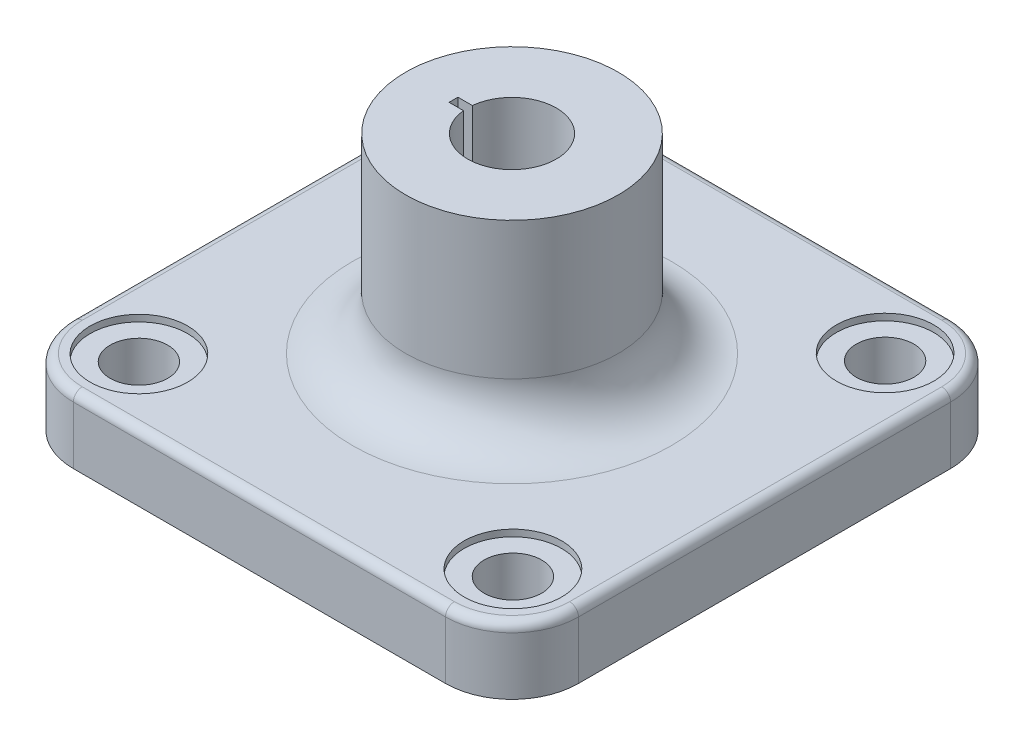
ISO-10303-21;
HEADER;
FILE_DESCRIPTION(('STEP AP214'),'2;1');
FILE_NAME('part.step','',(''),(''),'','','');
FILE_SCHEMA(('AUTOMOTIVE_DESIGN { 1 0 10303 214 1 1 1 1 }'));
ENDSEC;
DATA;
#1=APPLICATION_CONTEXT('core data for automotive mechanical design processes');
#2=APPLICATION_PROTOCOL_DEFINITION('international standard','automotive_design',2000,#1);
#3=PRODUCT_CONTEXT('',#1,'mechanical');
#4=PRODUCT('Part','Part','',(#3));
#5=PRODUCT_RELATED_PRODUCT_CATEGORY('part','',(#4));
#6=PRODUCT_DEFINITION_FORMATION('','',#4);
#7=PRODUCT_DEFINITION_CONTEXT('part definition',#1,'design');
#8=PRODUCT_DEFINITION('design','',#6,#7);
#9=PRODUCT_DEFINITION_SHAPE('','',#8);
#10=(LENGTH_UNIT() NAMED_UNIT(*) SI_UNIT(.MILLI.,.METRE.));
#11=(NAMED_UNIT(*) PLANE_ANGLE_UNIT() SI_UNIT($,.RADIAN.));
#12=(NAMED_UNIT(*) SI_UNIT($,.STERADIAN.) SOLID_ANGLE_UNIT());
#13=UNCERTAINTY_MEASURE_WITH_UNIT(LENGTH_MEASURE(1.E-05),#10,'distance_accuracy_value','');
#14=(GEOMETRIC_REPRESENTATION_CONTEXT(3) GLOBAL_UNCERTAINTY_ASSIGNED_CONTEXT((#13)) GLOBAL_UNIT_ASSIGNED_CONTEXT((#10,
#11,#12)) REPRESENTATION_CONTEXT('',''));
#15=CARTESIAN_POINT('',(0.,0.,0.));
#16=DIRECTION('',(0.,0.,1.));
#17=DIRECTION('',(1.,0.,0.));
#18=AXIS2_PLACEMENT_3D('',#15,#16,#17);
#19=CARTESIAN_POINT('',(99.2062555513264,-15.,-15.0000000000005));
#20=DIRECTION('',(0.,1.,0.));
#21=DIRECTION('',(0.,0.,1.));
#22=AXIS2_PLACEMENT_3D('',#19,#20,#21);
#23=CYLINDRICAL_SURFACE('',#22,6.5);
#24=CARTESIAN_POINT('',(99.2062555513264,-15.,-15.0000000000005));
#25=DIRECTION('',(0.,1.,0.));
#26=DIRECTION('',(-1.,0.,0.));
#27=AXIS2_PLACEMENT_3D('',#24,#25,#26);
#28=CIRCLE('',#27,6.5);
#29=CARTESIAN_POINT('',(92.7062555513264,-15.,-15.0000000000004));
#30=VERTEX_POINT('',#29);
#31=EDGE_CURVE('E490',#30,#30,#28,.T.);
#32=ORIENTED_EDGE('',*,*,#31,.F.);
#33=EDGE_LOOP('',(#32));
#34=FACE_BOUND('',#33,.T.);
#35=CARTESIAN_POINT('',(99.2062555513264,-1.5,-15.0000000000005));
#36=DIRECTION('',(0.,1.,0.));
#37=DIRECTION('',(-1.,0.,0.));
#38=AXIS2_PLACEMENT_3D('',#35,#36,#37);
#39=CIRCLE('',#38,6.5);
#40=CARTESIAN_POINT('',(92.7062555513264,-1.5,-15.0000000000004));
#41=VERTEX_POINT('',#40);
#42=EDGE_CURVE('E509',#41,#41,#39,.T.);
#43=ORIENTED_EDGE('',*,*,#42,.T.);
#44=EDGE_LOOP('',(#43));
#45=FACE_BOUND('',#44,.T.);
#46=ADVANCED_FACE('F33',(#34,#45),#23,.F.);
#47=CARTESIAN_POINT('',(15.,-15.,-14.7937444486741));
#48=DIRECTION('',(0.,1.,0.));
#49=DIRECTION('',(0.,0.,1.));
#50=AXIS2_PLACEMENT_3D('',#47,#48,#49);
#51=CYLINDRICAL_SURFACE('',#50,6.5);
#52=CARTESIAN_POINT('',(15.,-15.,-14.7937444486741));
#53=DIRECTION('',(0.,1.,0.));
#54=DIRECTION('',(0.,0.,-1.));
#55=AXIS2_PLACEMENT_3D('',#52,#53,#54);
#56=CIRCLE('',#55,6.5);
#57=CARTESIAN_POINT('',(15.,-15.,-21.2937444486741));
#58=VERTEX_POINT('',#57);
#59=EDGE_CURVE('E487',#58,#58,#56,.T.);
#60=ORIENTED_EDGE('',*,*,#59,.F.);
#61=EDGE_LOOP('',(#60));
#62=FACE_BOUND('',#61,.T.);
#63=CARTESIAN_POINT('',(15.,-1.5,-14.7937444486741));
#64=DIRECTION('',(0.,1.,0.));
#65=DIRECTION('',(0.,0.,-1.));
#66=AXIS2_PLACEMENT_3D('',#63,#64,#65);
#67=CIRCLE('',#66,6.5);
#68=CARTESIAN_POINT('',(15.,-1.5,-21.2937444486741));
#69=VERTEX_POINT('',#68);
#70=EDGE_CURVE('E502',#69,#69,#67,.T.);
#71=ORIENTED_EDGE('',*,*,#70,.T.);
#72=EDGE_LOOP('',(#71));
#73=FACE_BOUND('',#72,.T.);
#74=ADVANCED_FACE('F305',(#62,#73),#51,.F.);
#75=CARTESIAN_POINT('',(14.7937444486739,-15.,-98.9999999999998));
#76=DIRECTION('',(0.,1.,0.));
#77=DIRECTION('',(0.,0.,1.));
#78=AXIS2_PLACEMENT_3D('',#75,#76,#77);
#79=CYLINDRICAL_SURFACE('',#78,6.5);
#80=CARTESIAN_POINT('',(14.7937444486739,-15.,-98.9999999999998));
#81=DIRECTION('',(0.,1.,0.));
#82=DIRECTION('',(1.,0.,0.));
#83=AXIS2_PLACEMENT_3D('',#80,#81,#82);
#84=CIRCLE('',#83,6.5);
#85=CARTESIAN_POINT('',(21.2937444486739,-15.,-98.9999999999999));
#86=VERTEX_POINT('',#85);
#87=EDGE_CURVE('E482',#86,#86,#84,.T.);
#88=ORIENTED_EDGE('',*,*,#87,.F.);
#89=EDGE_LOOP('',(#88));
#90=FACE_BOUND('',#89,.T.);
#91=CARTESIAN_POINT('',(14.7937444486739,-1.5,-98.9999999999998));
#92=DIRECTION('',(0.,1.,0.));
#93=DIRECTION('',(1.,0.,0.));
#94=AXIS2_PLACEMENT_3D('',#91,#92,#93);
#95=CIRCLE('',#94,6.5);
#96=CARTESIAN_POINT('',(21.2937444486739,-1.5,-98.9999999999999));
#97=VERTEX_POINT('',#96);
#98=EDGE_CURVE('E495',#97,#97,#95,.T.);
#99=ORIENTED_EDGE('',*,*,#98,.T.);
#100=EDGE_LOOP('',(#99));
#101=FACE_BOUND('',#100,.T.);
#102=ADVANCED_FACE('F311',(#90,#101),#79,.F.);
#103=CARTESIAN_POINT('',(99.,-15.,-99.2062555513259));
#104=DIRECTION('',(0.,1.,0.));
#105=DIRECTION('',(0.,0.,1.));
#106=AXIS2_PLACEMENT_3D('',#103,#104,#105);
#107=CYLINDRICAL_SURFACE('',#106,6.5);
#108=CARTESIAN_POINT('',(99.,-15.,-99.2062555513259));
#109=DIRECTION('',(0.,1.,0.));
#110=DIRECTION('',(0.,0.,1.));
#111=AXIS2_PLACEMENT_3D('',#108,#109,#110);
#112=CIRCLE('',#111,6.5);
#113=CARTESIAN_POINT('',(99.,-15.,-92.7062555513259));
#114=VERTEX_POINT('',#113);
#115=EDGE_CURVE('E173',#114,#114,#112,.T.);
#116=ORIENTED_EDGE('',*,*,#115,.F.);
#117=EDGE_LOOP('',(#116));
#118=FACE_BOUND('',#117,.T.);
#119=CARTESIAN_POINT('',(99.,-1.5,-99.2062555513259));
#120=DIRECTION('',(0.,1.,0.));
#121=DIRECTION('',(0.,0.,1.));
#122=AXIS2_PLACEMENT_3D('',#119,#120,#121);
#123=CIRCLE('',#122,6.5);
#124=CARTESIAN_POINT('',(99.,-1.5,-92.7062555513259));
#125=VERTEX_POINT('',#124);
#126=EDGE_CURVE('E478',#125,#125,#123,.T.);
#127=ORIENTED_EDGE('',*,*,#126,.T.);
#128=EDGE_LOOP('',(#127));
#129=FACE_BOUND('',#128,.T.);
#130=ADVANCED_FACE('F322',(#118,#129),#107,.F.);
#131=CARTESIAN_POINT('',(0.,0.,-114.));
#132=DIRECTION('',(0.,1.,0.));
#133=DIRECTION('',(0.,0.,1.));
#134=AXIS2_PLACEMENT_3D('',#131,#132,#133);
#135=PLANE('',#134);
#136=CARTESIAN_POINT('',(99.2062555513264,0.,-15.0000000000005));
#137=DIRECTION('',(0.,1.,0.));
#138=DIRECTION('',(-1.,0.,0.));
#139=AXIS2_PLACEMENT_3D('',#136,#137,#138);
#140=CIRCLE('',#139,11.);
#141=CARTESIAN_POINT('',(88.2062555513264,0.,-15.0000000000003));
#142=VERTEX_POINT('',#141);
#143=EDGE_CURVE('E463',#142,#142,#140,.T.);
#144=ORIENTED_EDGE('',*,*,#143,.F.);
#145=EDGE_LOOP('',(#144));
#146=FACE_BOUND('',#145,.T.);
#147=CARTESIAN_POINT('',(15.,0.,-14.7937444486741));
#148=DIRECTION('',(0.,1.,0.));
#149=DIRECTION('',(0.,0.,-1.));
#150=AXIS2_PLACEMENT_3D('',#147,#148,#149);
#151=CIRCLE('',#150,11.);
#152=CARTESIAN_POINT('',(15.,0.,-25.7937444486741));
#153=VERTEX_POINT('',#152);
#154=EDGE_CURVE('E467',#153,#153,#151,.T.);
#155=ORIENTED_EDGE('',*,*,#154,.F.);
#156=EDGE_LOOP('',(#155));
#157=FACE_BOUND('',#156,.T.);
#158=CARTESIAN_POINT('',(14.7937444486739,0.,-98.9999999999998));
#159=DIRECTION('',(0.,1.,0.));
#160=DIRECTION('',(1.,0.,0.));
#161=AXIS2_PLACEMENT_3D('',#158,#159,#160);
#162=CIRCLE('',#161,11.);
#163=CARTESIAN_POINT('',(25.7937444486739,0.,-98.9999999999999));
#164=VERTEX_POINT('',#163);
#165=EDGE_CURVE('E471',#164,#164,#162,.T.);
#166=ORIENTED_EDGE('',*,*,#165,.F.);
#167=EDGE_LOOP('',(#166));
#168=FACE_BOUND('',#167,.T.);
#169=CARTESIAN_POINT('',(99.,0.,-99.2062555513259));
#170=DIRECTION('',(0.,1.,0.));
#171=DIRECTION('',(0.,0.,1.));
#172=AXIS2_PLACEMENT_3D('',#169,#170,#171);
#173=CIRCLE('',#172,11.);
#174=CARTESIAN_POINT('',(99.,0.,-88.2062555513259));
#175=VERTEX_POINT('',#174);
#176=EDGE_CURVE('E475',#175,#175,#173,.T.);
#177=ORIENTED_EDGE('',*,*,#176,.F.);
#178=EDGE_LOOP('',(#177));
#179=FACE_BOUND('',#178,.T.);
#180=CARTESIAN_POINT('',(57.,0.,-57.));
#181=DIRECTION('',(0.,1.,0.));
#182=DIRECTION('',(0.,0.,1.));
#183=AXIS2_PLACEMENT_3D('',#180,#181,#182);
#184=CIRCLE('',#183,36.);
#185=CARTESIAN_POINT('',(57.,0.,-21.));
#186=VERTEX_POINT('',#185);
#187=EDGE_CURVE('E11',#186,#186,#184,.F.);
#188=ORIENTED_EDGE('',*,*,#187,.T.);
#189=EDGE_LOOP('',(#188));
#190=FACE_BOUND('',#189,.T.);
#191=DIRECTION('',(-1.,0.,0.));
#192=VECTOR('',#191,1.);
#193=CARTESIAN_POINT('',(99.,0.,-2.));
#194=LINE('',#193,#192);
#195=CARTESIAN_POINT('',(15.,0.,-2.));
#196=VERTEX_POINT('',#195);
#197=CARTESIAN_POINT('',(99.,0.,-2.));
#198=VERTEX_POINT('',#197);
#199=EDGE_CURVE('E231',#196,#198,#194,.F.);
#200=ORIENTED_EDGE('',*,*,#199,.T.);
#201=CARTESIAN_POINT('',(99.,0.,-15.));
#202=DIRECTION('',(0.,1.,0.));
#203=DIRECTION('',(0.,0.,1.));
#204=AXIS2_PLACEMENT_3D('',#201,#202,#203);
#205=CIRCLE('',#204,13.);
#206=CARTESIAN_POINT('',(112.,0.,-15.));
#207=VERTEX_POINT('',#206);
#208=EDGE_CURVE('E245',#198,#207,#205,.T.);
#209=ORIENTED_EDGE('',*,*,#208,.T.);
#210=DIRECTION('',(0.,0.,1.));
#211=VECTOR('',#210,1.);
#212=CARTESIAN_POINT('',(112.,0.,-114.));
#213=LINE('',#212,#211);
#214=CARTESIAN_POINT('',(112.,0.,-99.));
#215=VERTEX_POINT('',#214);
#216=EDGE_CURVE('E243',#207,#215,#213,.F.);
#217=ORIENTED_EDGE('',*,*,#216,.T.);
#218=CARTESIAN_POINT('',(99.,0.,-99.));
#219=DIRECTION('',(0.,1.,0.));
#220=DIRECTION('',(0.,0.,1.));
#221=AXIS2_PLACEMENT_3D('',#218,#219,#220);
#222=CIRCLE('',#221,13.);
#223=CARTESIAN_POINT('',(99.,0.,-112.));
#224=VERTEX_POINT('',#223);
#225=EDGE_CURVE('E241',#215,#224,#222,.T.);
#226=ORIENTED_EDGE('',*,*,#225,.T.);
#227=DIRECTION('',(-1.,0.,0.));
#228=VECTOR('',#227,1.);
#229=CARTESIAN_POINT('',(0.,0.,-112.));
#230=LINE('',#229,#228);
#231=CARTESIAN_POINT('',(15.,0.,-112.));
#232=VERTEX_POINT('',#231);
#233=EDGE_CURVE('E239',#224,#232,#230,.T.);
#234=ORIENTED_EDGE('',*,*,#233,.T.);
#235=CARTESIAN_POINT('',(15.,0.,-99.));
#236=DIRECTION('',(0.,1.,0.));
#237=DIRECTION('',(0.,0.,1.));
#238=AXIS2_PLACEMENT_3D('',#235,#236,#237);
#239=CIRCLE('',#238,13.);
#240=CARTESIAN_POINT('',(2.,0.,-99.));
#241=VERTEX_POINT('',#240);
#242=EDGE_CURVE('E237',#232,#241,#239,.T.);
#243=ORIENTED_EDGE('',*,*,#242,.T.);
#244=DIRECTION('',(0.,0.,1.));
#245=VECTOR('',#244,1.);
#246=CARTESIAN_POINT('',(2.,0.,-114.));
#247=LINE('',#246,#245);
#248=CARTESIAN_POINT('',(2.,0.,-15.));
#249=VERTEX_POINT('',#248);
#250=EDGE_CURVE('E235',#241,#249,#247,.T.);
#251=ORIENTED_EDGE('',*,*,#250,.T.);
#252=CARTESIAN_POINT('',(15.,0.,-15.));
#253=DIRECTION('',(0.,1.,0.));
#254=DIRECTION('',(0.,0.,1.));
#255=AXIS2_PLACEMENT_3D('',#252,#253,#254);
#256=CIRCLE('',#255,13.);
#257=EDGE_CURVE('E233',#249,#196,#256,.T.);
#258=ORIENTED_EDGE('',*,*,#257,.T.);
#259=EDGE_LOOP('',(#200,#209,#217,#226,#234,#243,#251,#258));
#260=FACE_BOUND('',#259,.T.);
#261=ADVANCED_FACE('F302',(#146,#157,#168,#179,#190,#260),#135,.T.);
#262=CARTESIAN_POINT('',(0.,-15.,-114.));
#263=DIRECTION('',(-1.,0.,0.));
#264=DIRECTION('',(0.,0.,1.));
#265=AXIS2_PLACEMENT_3D('',#262,#263,#264);
#266=PLANE('',#265);
#267=DIRECTION('',(0.,-1.,0.));
#268=VECTOR('',#267,1.);
#269=CARTESIAN_POINT('',(0.,0.,-15.));
#270=LINE('',#269,#268);
#271=CARTESIAN_POINT('',(0.,-15.,-15.));
#272=VERTEX_POINT('',#271);
#273=CARTESIAN_POINT('',(0.,-2.,-15.));
#274=VERTEX_POINT('',#273);
#275=EDGE_CURVE('E201',#272,#274,#270,.F.);
#276=ORIENTED_EDGE('',*,*,#275,.T.);
#277=DIRECTION('',(0.,0.,1.));
#278=VECTOR('',#277,1.);
#279=CARTESIAN_POINT('',(0.,-2.,-114.));
#280=LINE('',#279,#278);
#281=CARTESIAN_POINT('',(0.,-2.,-99.));
#282=VERTEX_POINT('',#281);
#283=EDGE_CURVE('E259',#274,#282,#280,.F.);
#284=ORIENTED_EDGE('',*,*,#283,.T.);
#285=DIRECTION('',(0.,-1.,0.));
#286=VECTOR('',#285,1.);
#287=CARTESIAN_POINT('',(0.,-15.,-99.));
#288=LINE('',#287,#286);
#289=CARTESIAN_POINT('',(0.,-15.,-99.));
#290=VERTEX_POINT('',#289);
#291=EDGE_CURVE('E206',#282,#290,#288,.T.);
#292=ORIENTED_EDGE('',*,*,#291,.T.);
#293=DIRECTION('',(0.,0.,1.));
#294=VECTOR('',#293,1.);
#295=CARTESIAN_POINT('',(0.,-15.,-114.));
#296=LINE('',#295,#294);
#297=EDGE_CURVE('E193',#290,#272,#296,.T.);
#298=ORIENTED_EDGE('',*,*,#297,.T.);
#299=EDGE_LOOP('',(#276,#284,#292,#298));
#300=FACE_BOUND('',#299,.T.);
#301=ADVANCED_FACE('F360',(#300),#266,.T.);
#302=CARTESIAN_POINT('',(114.,0.,-114.));
#303=DIRECTION('',(1.,0.,0.));
#304=DIRECTION('',(0.,1.,0.));
#305=AXIS2_PLACEMENT_3D('',#302,#303,#304);
#306=PLANE('',#305);
#307=DIRECTION('',(0.,1.,0.));
#308=VECTOR('',#307,1.);
#309=CARTESIAN_POINT('',(114.,0.,-99.));
#310=LINE('',#309,#308);
#311=CARTESIAN_POINT('',(114.,-15.,-99.));
#312=VERTEX_POINT('',#311);
#313=CARTESIAN_POINT('',(114.,-2.,-99.));
#314=VERTEX_POINT('',#313);
#315=EDGE_CURVE('E228',#312,#314,#310,.T.);
#316=ORIENTED_EDGE('',*,*,#315,.T.);
#317=DIRECTION('',(0.,0.,1.));
#318=VECTOR('',#317,1.);
#319=CARTESIAN_POINT('',(114.,-2.,-114.));
#320=LINE('',#319,#318);
#321=CARTESIAN_POINT('',(114.,-2.,-15.));
#322=VERTEX_POINT('',#321);
#323=EDGE_CURVE('E251',#314,#322,#320,.T.);
#324=ORIENTED_EDGE('',*,*,#323,.T.);
#325=DIRECTION('',(0.,1.,0.));
#326=VECTOR('',#325,1.);
#327=CARTESIAN_POINT('',(114.,-15.,-15.));
#328=LINE('',#327,#326);
#329=CARTESIAN_POINT('',(114.,-15.,-15.));
#330=VERTEX_POINT('',#329);
#331=EDGE_CURVE('E226',#322,#330,#328,.F.);
#332=ORIENTED_EDGE('',*,*,#331,.T.);
#333=DIRECTION('',(0.,0.,1.));
#334=VECTOR('',#333,1.);
#335=CARTESIAN_POINT('',(114.,-15.,-114.));
#336=LINE('',#335,#334);
#337=EDGE_CURVE('E198',#312,#330,#336,.T.);
#338=ORIENTED_EDGE('',*,*,#337,.F.);
#339=EDGE_LOOP('',(#316,#324,#332,#338));
#340=FACE_BOUND('',#339,.T.);
#341=ADVANCED_FACE('F357',(#340),#306,.T.);
#342=CARTESIAN_POINT('',(114.,-15.,-114.));
#343=DIRECTION('',(0.,-1.,0.));
#344=DIRECTION('',(1.,0.,0.));
#345=AXIS2_PLACEMENT_3D('',#342,#343,#344);
#346=PLANE('',#345);
#347=ORIENTED_EDGE('',*,*,#31,.T.);
#348=EDGE_LOOP('',(#347));
#349=FACE_BOUND('',#348,.T.);
#350=ORIENTED_EDGE('',*,*,#59,.T.);
#351=EDGE_LOOP('',(#350));
#352=FACE_BOUND('',#351,.T.);
#353=ORIENTED_EDGE('',*,*,#87,.T.);
#354=EDGE_LOOP('',(#353));
#355=FACE_BOUND('',#354,.T.);
#356=ORIENTED_EDGE('',*,*,#115,.T.);
#357=EDGE_LOOP('',(#356));
#358=FACE_BOUND('',#357,.T.);
#359=ORIENTED_EDGE('',*,*,#297,.F.);
#360=CARTESIAN_POINT('',(15.,-15.,-99.));
#361=DIRECTION('',(0.,-1.,0.));
#362=DIRECTION('',(1.,0.,0.));
#363=AXIS2_PLACEMENT_3D('',#360,#361,#362);
#364=CIRCLE('',#363,15.);
#365=CARTESIAN_POINT('',(15.,-15.,-114.));
#366=VERTEX_POINT('',#365);
#367=EDGE_CURVE('E214',#290,#366,#364,.T.);
#368=ORIENTED_EDGE('',*,*,#367,.T.);
#369=DIRECTION('',(1.,0.,0.));
#370=VECTOR('',#369,1.);
#371=CARTESIAN_POINT('',(114.,-15.,-114.));
#372=LINE('',#371,#370);
#373=CARTESIAN_POINT('',(99.,-15.,-114.));
#374=VERTEX_POINT('',#373);
#375=EDGE_CURVE('E190',#366,#374,#372,.T.);
#376=ORIENTED_EDGE('',*,*,#375,.T.);
#377=CARTESIAN_POINT('',(99.,-15.,-99.));
#378=DIRECTION('',(0.,-1.,0.));
#379=DIRECTION('',(1.,0.,0.));
#380=AXIS2_PLACEMENT_3D('',#377,#378,#379);
#381=CIRCLE('',#380,15.);
#382=EDGE_CURVE('E210',#374,#312,#381,.T.);
#383=ORIENTED_EDGE('',*,*,#382,.T.);
#384=ORIENTED_EDGE('',*,*,#337,.T.);
#385=CARTESIAN_POINT('',(99.,-15.,-15.));
#386=DIRECTION('',(0.,-1.,0.));
#387=DIRECTION('',(1.,0.,0.));
#388=AXIS2_PLACEMENT_3D('',#385,#386,#387);
#389=CIRCLE('',#388,15.);
#390=CARTESIAN_POINT('',(99.,-15.,0.));
#391=VERTEX_POINT('',#390);
#392=EDGE_CURVE('E208',#330,#391,#389,.T.);
#393=ORIENTED_EDGE('',*,*,#392,.T.);
#394=DIRECTION('',(1.,0.,0.));
#395=VECTOR('',#394,1.);
#396=CARTESIAN_POINT('',(114.,-15.,0.));
#397=LINE('',#396,#395);
#398=CARTESIAN_POINT('',(15.,-15.,0.));
#399=VERTEX_POINT('',#398);
#400=EDGE_CURVE('E194',#399,#391,#397,.T.);
#401=ORIENTED_EDGE('',*,*,#400,.F.);
#402=CARTESIAN_POINT('',(15.,-15.,-15.));
#403=DIRECTION('',(0.,-1.,0.));
#404=DIRECTION('',(1.,0.,0.));
#405=AXIS2_PLACEMENT_3D('',#402,#403,#404);
#406=CIRCLE('',#405,15.);
#407=EDGE_CURVE('E212',#399,#272,#406,.T.);
#408=ORIENTED_EDGE('',*,*,#407,.T.);
#409=EDGE_LOOP('',(#359,#368,#376,#383,#384,#393,#401,#408));
#410=FACE_BOUND('',#409,.T.);
#411=ADVANCED_FACE('F351',(#349,#352,#355,#358,#410),#346,.T.);
#412=CARTESIAN_POINT('',(0.,0.,-114.));
#413=DIRECTION('',(0.,0.,-1.));
#414=DIRECTION('',(-1.,0.,0.));
#415=AXIS2_PLACEMENT_3D('',#412,#413,#414);
#416=PLANE('',#415);
#417=DIRECTION('',(0.,-1.,0.));
#418=VECTOR('',#417,1.);
#419=CARTESIAN_POINT('',(15.,0.,-114.));
#420=LINE('',#419,#418);
#421=CARTESIAN_POINT('',(15.,-2.,-114.));
#422=VERTEX_POINT('',#421);
#423=EDGE_CURVE('E218',#366,#422,#420,.F.);
#424=ORIENTED_EDGE('',*,*,#423,.T.);
#425=DIRECTION('',(-1.,0.,0.));
#426=VECTOR('',#425,1.);
#427=CARTESIAN_POINT('',(0.,-2.,-114.));
#428=LINE('',#427,#426);
#429=CARTESIAN_POINT('',(99.,-2.,-114.));
#430=VERTEX_POINT('',#429);
#431=EDGE_CURVE('E255',#422,#430,#428,.F.);
#432=ORIENTED_EDGE('',*,*,#431,.T.);
#433=DIRECTION('',(0.,1.,0.));
#434=VECTOR('',#433,1.);
#435=CARTESIAN_POINT('',(99.,0.,-114.));
#436=LINE('',#435,#434);
#437=EDGE_CURVE('E216',#430,#374,#436,.F.);
#438=ORIENTED_EDGE('',*,*,#437,.T.);
#439=ORIENTED_EDGE('',*,*,#375,.F.);
#440=EDGE_LOOP('',(#424,#432,#438,#439));
#441=FACE_BOUND('',#440,.T.);
#442=ADVANCED_FACE('F347',(#441),#416,.T.);
#443=CARTESIAN_POINT('',(0.,0.,0.));
#444=DIRECTION('',(0.,0.,-1.));
#445=DIRECTION('',(-1.,0.,0.));
#446=AXIS2_PLACEMENT_3D('',#443,#444,#445);
#447=PLANE('',#446);
#448=DIRECTION('',(0.,1.,0.));
#449=VECTOR('',#448,1.);
#450=CARTESIAN_POINT('',(99.,0.,0.));
#451=LINE('',#450,#449);
#452=CARTESIAN_POINT('',(99.,-2.,0.));
#453=VERTEX_POINT('',#452);
#454=EDGE_CURVE('E221',#391,#453,#451,.T.);
#455=ORIENTED_EDGE('',*,*,#454,.T.);
#456=DIRECTION('',(-1.,0.,0.));
#457=VECTOR('',#456,1.);
#458=CARTESIAN_POINT('',(15.,-2.,0.));
#459=LINE('',#458,#457);
#460=CARTESIAN_POINT('',(15.,-2.,0.));
#461=VERTEX_POINT('',#460);
#462=EDGE_CURVE('E263',#453,#461,#459,.T.);
#463=ORIENTED_EDGE('',*,*,#462,.T.);
#464=DIRECTION('',(0.,-1.,0.));
#465=VECTOR('',#464,1.);
#466=CARTESIAN_POINT('',(15.,-15.,0.));
#467=LINE('',#466,#465);
#468=EDGE_CURVE('E224',#461,#399,#467,.T.);
#469=ORIENTED_EDGE('',*,*,#468,.T.);
#470=ORIENTED_EDGE('',*,*,#400,.T.);
#471=EDGE_LOOP('',(#455,#463,#469,#470));
#472=FACE_BOUND('',#471,.T.);
#473=ADVANCED_FACE('F350',(#472),#447,.F.);
#474=CARTESIAN_POINT('',(15.,-15.,-99.));
#475=DIRECTION('',(0.,-1.,0.));
#476=DIRECTION('',(0.,0.,-1.));
#477=AXIS2_PLACEMENT_3D('',#474,#475,#476);
#478=CYLINDRICAL_SURFACE('',#477,15.);
#479=ORIENTED_EDGE('',*,*,#291,.F.);
#480=CARTESIAN_POINT('',(15.,-2.,-99.));
#481=DIRECTION('',(0.,1.,0.));
#482=DIRECTION('',(0.,0.,1.));
#483=AXIS2_PLACEMENT_3D('',#480,#481,#482);
#484=CIRCLE('',#483,15.);
#485=EDGE_CURVE('E257',#282,#422,#484,.F.);
#486=ORIENTED_EDGE('',*,*,#485,.T.);
#487=ORIENTED_EDGE('',*,*,#423,.F.);
#488=ORIENTED_EDGE('',*,*,#367,.F.);
#489=EDGE_LOOP('',(#479,#486,#487,#488));
#490=FACE_BOUND('',#489,.T.);
#491=ADVANCED_FACE('F354',(#490),#478,.T.);
#492=CARTESIAN_POINT('',(15.,0.,-15.));
#493=DIRECTION('',(0.,1.,0.));
#494=DIRECTION('',(0.,0.,1.));
#495=AXIS2_PLACEMENT_3D('',#492,#493,#494);
#496=CYLINDRICAL_SURFACE('',#495,15.);
#497=ORIENTED_EDGE('',*,*,#468,.F.);
#498=CARTESIAN_POINT('',(15.,-2.,-15.));
#499=DIRECTION('',(0.,1.,0.));
#500=DIRECTION('',(0.,0.,1.));
#501=AXIS2_PLACEMENT_3D('',#498,#499,#500);
#502=CIRCLE('',#501,15.);
#503=EDGE_CURVE('E261',#461,#274,#502,.F.);
#504=ORIENTED_EDGE('',*,*,#503,.T.);
#505=ORIENTED_EDGE('',*,*,#275,.F.);
#506=ORIENTED_EDGE('',*,*,#407,.F.);
#507=EDGE_LOOP('',(#497,#504,#505,#506));
#508=FACE_BOUND('',#507,.T.);
#509=ADVANCED_FACE('F370',(#508),#496,.T.);
#510=CARTESIAN_POINT('',(99.,0.,-99.));
#511=DIRECTION('',(0.,1.,0.));
#512=DIRECTION('',(-1.,0.,0.));
#513=AXIS2_PLACEMENT_3D('',#510,#511,#512);
#514=CYLINDRICAL_SURFACE('',#513,15.);
#515=ORIENTED_EDGE('',*,*,#437,.F.);
#516=CARTESIAN_POINT('',(99.,-2.,-99.));
#517=DIRECTION('',(0.,1.,0.));
#518=DIRECTION('',(0.,0.,1.));
#519=AXIS2_PLACEMENT_3D('',#516,#517,#518);
#520=CIRCLE('',#519,15.);
#521=EDGE_CURVE('E253',#430,#314,#520,.F.);
#522=ORIENTED_EDGE('',*,*,#521,.T.);
#523=ORIENTED_EDGE('',*,*,#315,.F.);
#524=ORIENTED_EDGE('',*,*,#382,.F.);
#525=EDGE_LOOP('',(#515,#522,#523,#524));
#526=FACE_BOUND('',#525,.T.);
#527=ADVANCED_FACE('F374',(#526),#514,.T.);
#528=CARTESIAN_POINT('',(99.,0.,-15.));
#529=DIRECTION('',(0.,-1.,0.));
#530=DIRECTION('',(1.,0.,0.));
#531=AXIS2_PLACEMENT_3D('',#528,#529,#530);
#532=CYLINDRICAL_SURFACE('',#531,15.);
#533=ORIENTED_EDGE('',*,*,#331,.F.);
#534=CARTESIAN_POINT('',(99.,-2.,-15.));
#535=DIRECTION('',(0.,1.,0.));
#536=DIRECTION('',(0.,0.,1.));
#537=AXIS2_PLACEMENT_3D('',#534,#535,#536);
#538=CIRCLE('',#537,15.);
#539=EDGE_CURVE('E248',#322,#453,#538,.F.);
#540=ORIENTED_EDGE('',*,*,#539,.T.);
#541=ORIENTED_EDGE('',*,*,#454,.F.);
#542=ORIENTED_EDGE('',*,*,#392,.F.);
#543=EDGE_LOOP('',(#533,#540,#541,#542));
#544=FACE_BOUND('',#543,.T.);
#545=ADVANCED_FACE('F378',(#544),#532,.T.);
#546=CARTESIAN_POINT('',(15.,-2.,-99.));
#547=DIRECTION('',(0.,1.,0.));
#548=DIRECTION('',(0.,0.,1.));
#549=AXIS2_PLACEMENT_3D('',#546,#547,#548);
#550=TOROIDAL_SURFACE('',#549,13.,2.);
#551=CARTESIAN_POINT('',(15.,-2.,-112.));
#552=DIRECTION('',(1.,0.,0.));
#553=DIRECTION('',(0.,0.,-1.));
#554=AXIS2_PLACEMENT_3D('',#551,#552,#553);
#555=CIRCLE('',#554,2.);
#556=EDGE_CURVE('E280',#422,#232,#555,.T.);
#557=ORIENTED_EDGE('',*,*,#556,.F.);
#558=ORIENTED_EDGE('',*,*,#485,.F.);
#559=CARTESIAN_POINT('',(2.,-2.,-99.));
#560=DIRECTION('',(0.,0.,1.));
#561=DIRECTION('',(1.,0.,0.));
#562=AXIS2_PLACEMENT_3D('',#559,#560,#561);
#563=CIRCLE('',#562,2.);
#564=EDGE_CURVE('E197',#241,#282,#563,.T.);
#565=ORIENTED_EDGE('',*,*,#564,.F.);
#566=ORIENTED_EDGE('',*,*,#242,.F.);
#567=EDGE_LOOP('',(#557,#558,#565,#566));
#568=FACE_BOUND('',#567,.T.);
#569=ADVANCED_FACE('F382',(#568),#550,.T.);
#570=CARTESIAN_POINT('',(2.,-2.,-114.));
#571=DIRECTION('',(0.,0.,1.));
#572=DIRECTION('',(1.,0.,0.));
#573=AXIS2_PLACEMENT_3D('',#570,#571,#572);
#574=CYLINDRICAL_SURFACE('',#573,2.);
#575=ORIENTED_EDGE('',*,*,#564,.T.);
#576=ORIENTED_EDGE('',*,*,#283,.F.);
#577=CARTESIAN_POINT('',(2.,-2.,-15.));
#578=DIRECTION('',(0.,0.,1.));
#579=DIRECTION('',(1.,0.,0.));
#580=AXIS2_PLACEMENT_3D('',#577,#578,#579);
#581=CIRCLE('',#580,2.);
#582=EDGE_CURVE('E277',#249,#274,#581,.T.);
#583=ORIENTED_EDGE('',*,*,#582,.F.);
#584=ORIENTED_EDGE('',*,*,#250,.F.);
#585=EDGE_LOOP('',(#575,#576,#583,#584));
#586=FACE_BOUND('',#585,.T.);
#587=ADVANCED_FACE('F406',(#586),#574,.T.);
#588=CARTESIAN_POINT('',(0.,-2.,-112.));
#589=DIRECTION('',(-1.,0.,0.));
#590=DIRECTION('',(0.,0.,1.));
#591=AXIS2_PLACEMENT_3D('',#588,#589,#590);
#592=CYLINDRICAL_SURFACE('',#591,2.);
#593=ORIENTED_EDGE('',*,*,#556,.T.);
#594=ORIENTED_EDGE('',*,*,#233,.F.);
#595=CARTESIAN_POINT('',(99.,-2.,-112.));
#596=DIRECTION('',(1.,0.,0.));
#597=DIRECTION('',(0.,0.,-1.));
#598=AXIS2_PLACEMENT_3D('',#595,#596,#597);
#599=CIRCLE('',#598,2.);
#600=EDGE_CURVE('E274',#430,#224,#599,.T.);
#601=ORIENTED_EDGE('',*,*,#600,.F.);
#602=ORIENTED_EDGE('',*,*,#431,.F.);
#603=EDGE_LOOP('',(#593,#594,#601,#602));
#604=FACE_BOUND('',#603,.T.);
#605=ADVANCED_FACE('F402',(#604),#592,.T.);
#606=CARTESIAN_POINT('',(15.,-2.,-15.));
#607=DIRECTION('',(0.,1.,0.));
#608=DIRECTION('',(0.,0.,1.));
#609=AXIS2_PLACEMENT_3D('',#606,#607,#608);
#610=TOROIDAL_SURFACE('',#609,13.,2.);
#611=ORIENTED_EDGE('',*,*,#582,.T.);
#612=ORIENTED_EDGE('',*,*,#503,.F.);
#613=CARTESIAN_POINT('',(15.,-2.,-2.));
#614=DIRECTION('',(1.,0.,0.));
#615=DIRECTION('',(0.,0.,-1.));
#616=AXIS2_PLACEMENT_3D('',#613,#614,#615);
#617=CIRCLE('',#616,2.);
#618=EDGE_CURVE('E271',#196,#461,#617,.T.);
#619=ORIENTED_EDGE('',*,*,#618,.F.);
#620=ORIENTED_EDGE('',*,*,#257,.F.);
#621=EDGE_LOOP('',(#611,#612,#619,#620));
#622=FACE_BOUND('',#621,.T.);
#623=ADVANCED_FACE('F398',(#622),#610,.T.);
#624=CARTESIAN_POINT('',(99.,-2.,-99.));
#625=DIRECTION('',(0.,1.,0.));
#626=DIRECTION('',(0.,0.,1.));
#627=AXIS2_PLACEMENT_3D('',#624,#625,#626);
#628=TOROIDAL_SURFACE('',#627,13.,2.);
#629=ORIENTED_EDGE('',*,*,#600,.T.);
#630=ORIENTED_EDGE('',*,*,#225,.F.);
#631=CARTESIAN_POINT('',(112.,-2.,-99.));
#632=DIRECTION('',(0.,0.,1.));
#633=DIRECTION('',(1.,0.,0.));
#634=AXIS2_PLACEMENT_3D('',#631,#632,#633);
#635=CIRCLE('',#634,2.);
#636=EDGE_CURVE('E268',#314,#215,#635,.T.);
#637=ORIENTED_EDGE('',*,*,#636,.F.);
#638=ORIENTED_EDGE('',*,*,#521,.F.);
#639=EDGE_LOOP('',(#629,#630,#637,#638));
#640=FACE_BOUND('',#639,.T.);
#641=ADVANCED_FACE('F394',(#640),#628,.T.);
#642=CARTESIAN_POINT('',(0.,-2.,-2.));
#643=DIRECTION('',(1.,0.,0.));
#644=DIRECTION('',(0.,0.,-1.));
#645=AXIS2_PLACEMENT_3D('',#642,#643,#644);
#646=CYLINDRICAL_SURFACE('',#645,2.);
#647=ORIENTED_EDGE('',*,*,#618,.T.);
#648=ORIENTED_EDGE('',*,*,#462,.F.);
#649=CARTESIAN_POINT('',(99.,-2.,-2.));
#650=DIRECTION('',(1.,0.,0.));
#651=DIRECTION('',(0.,0.,-1.));
#652=AXIS2_PLACEMENT_3D('',#649,#650,#651);
#653=CIRCLE('',#652,2.);
#654=EDGE_CURVE('E266',#198,#453,#653,.T.);
#655=ORIENTED_EDGE('',*,*,#654,.F.);
#656=ORIENTED_EDGE('',*,*,#199,.F.);
#657=EDGE_LOOP('',(#647,#648,#655,#656));
#658=FACE_BOUND('',#657,.T.);
#659=ADVANCED_FACE('F390',(#658),#646,.T.);
#660=CARTESIAN_POINT('',(112.,-2.,-114.));
#661=DIRECTION('',(0.,0.,1.));
#662=DIRECTION('',(1.,0.,0.));
#663=AXIS2_PLACEMENT_3D('',#660,#661,#662);
#664=CYLINDRICAL_SURFACE('',#663,2.);
#665=ORIENTED_EDGE('',*,*,#636,.T.);
#666=ORIENTED_EDGE('',*,*,#216,.F.);
#667=CARTESIAN_POINT('',(112.,-2.,-15.));
#668=DIRECTION('',(0.,0.,1.));
#669=DIRECTION('',(1.,0.,0.));
#670=AXIS2_PLACEMENT_3D('',#667,#668,#669);
#671=CIRCLE('',#670,2.);
#672=EDGE_CURVE('E154',#322,#207,#671,.T.);
#673=ORIENTED_EDGE('',*,*,#672,.F.);
#674=ORIENTED_EDGE('',*,*,#323,.F.);
#675=EDGE_LOOP('',(#665,#666,#673,#674));
#676=FACE_BOUND('',#675,.T.);
#677=ADVANCED_FACE('F386',(#676),#664,.T.);
#678=CARTESIAN_POINT('',(99.,-2.,-15.));
#679=DIRECTION('',(0.,1.,0.));
#680=DIRECTION('',(0.,0.,1.));
#681=AXIS2_PLACEMENT_3D('',#678,#679,#680);
#682=TOROIDAL_SURFACE('',#681,13.,2.);
#683=ORIENTED_EDGE('',*,*,#654,.T.);
#684=ORIENTED_EDGE('',*,*,#539,.F.);
#685=ORIENTED_EDGE('',*,*,#672,.T.);
#686=ORIENTED_EDGE('',*,*,#208,.F.);
#687=EDGE_LOOP('',(#683,#684,#685,#686));
#688=FACE_BOUND('',#687,.T.);
#689=ADVANCED_FACE('F346',(#688),#682,.T.);
#690=CARTESIAN_POINT('',(57.,43.,-57.));
#691=DIRECTION('',(0.,-1.,0.));
#692=DIRECTION('',(0.,0.,-1.));
#693=AXIS2_PLACEMENT_3D('',#690,#691,#692);
#694=CYLINDRICAL_SURFACE('',#693,9.99999999999999);
#695=CARTESIAN_POINT('',(57.,0.,-57.));
#696=DIRECTION('',(0.,1.,0.));
#697=DIRECTION('',(0.,0.,1.));
#698=AXIS2_PLACEMENT_3D('',#695,#696,#697);
#699=CIRCLE('',#698,9.99999999999999);
#700=CARTESIAN_POINT('',(47.0501256289338,0.,-56.));
#701=VERTEX_POINT('',#700);
#702=CARTESIAN_POINT('',(47.0501256289338,0.,-58.));
#703=VERTEX_POINT('',#702);
#704=EDGE_CURVE('E152',#701,#703,#699,.T.);
#705=ORIENTED_EDGE('',*,*,#704,.F.);
#706=DIRECTION('',(0.,-1.,0.));
#707=VECTOR('',#706,1.);
#708=CARTESIAN_POINT('',(47.0501256289338,43.,-56.));
#709=LINE('',#708,#707);
#710=CARTESIAN_POINT('',(47.0501256289338,43.,-56.));
#711=VERTEX_POINT('',#710);
#712=EDGE_CURVE('E145',#711,#701,#709,.T.);
#713=ORIENTED_EDGE('',*,*,#712,.F.);
#714=CARTESIAN_POINT('',(57.,43.,-57.));
#715=DIRECTION('',(0.,1.,0.));
#716=DIRECTION('',(0.,0.,1.));
#717=AXIS2_PLACEMENT_3D('',#714,#715,#716);
#718=CIRCLE('',#717,9.99999999999999);
#719=CARTESIAN_POINT('',(47.0501256289338,43.,-58.));
#720=VERTEX_POINT('',#719);
#721=EDGE_CURVE('E150',#711,#720,#718,.T.);
#722=ORIENTED_EDGE('',*,*,#721,.T.);
#723=DIRECTION('',(0.,-1.,0.));
#724=VECTOR('',#723,1.);
#725=CARTESIAN_POINT('',(47.0501256289338,43.,-58.));
#726=LINE('',#725,#724);
#727=EDGE_CURVE('E181',#720,#703,#726,.T.);
#728=ORIENTED_EDGE('',*,*,#727,.T.);
#729=EDGE_LOOP('',(#705,#713,#722,#728));
#730=FACE_BOUND('',#729,.T.);
#731=ADVANCED_FACE('F147',(#730),#694,.F.);
#732=CARTESIAN_POINT('',(-64.1414213562373,43.,-56.0000000000002));
#733=DIRECTION('',(0.,0.,1.));
#734=DIRECTION('',(1.,0.,0.));
#735=AXIS2_PLACEMENT_3D('',#732,#733,#734);
#736=PLANE('',#735);
#737=DIRECTION('',(-1.,0.,0.));
#738=VECTOR('',#737,1.);
#739=CARTESIAN_POINT('',(-64.1414213562373,0.,-56.0000000000002));
#740=LINE('',#739,#738);
#741=CARTESIAN_POINT('',(43.8,0.,-56.));
#742=VERTEX_POINT('',#741);
#743=EDGE_CURVE('E48',#701,#742,#740,.T.);
#744=ORIENTED_EDGE('',*,*,#743,.T.);
#745=DIRECTION('',(0.,-1.,0.));
#746=VECTOR('',#745,1.);
#747=CARTESIAN_POINT('',(43.8,43.,-56.));
#748=LINE('',#747,#746);
#749=CARTESIAN_POINT('',(43.8,43.,-56.));
#750=VERTEX_POINT('',#749);
#751=EDGE_CURVE('E155',#750,#742,#748,.T.);
#752=ORIENTED_EDGE('',*,*,#751,.F.);
#753=DIRECTION('',(-1.,0.,0.));
#754=VECTOR('',#753,1.);
#755=CARTESIAN_POINT('',(-64.1414213562373,43.,-56.0000000000002));
#756=LINE('',#755,#754);
#757=EDGE_CURVE('E158',#711,#750,#756,.T.);
#758=ORIENTED_EDGE('',*,*,#757,.F.);
#759=ORIENTED_EDGE('',*,*,#712,.T.);
#760=EDGE_LOOP('',(#744,#752,#758,#759));
#761=FACE_BOUND('',#760,.T.);
#762=ADVANCED_FACE('F159',(#761),#736,.F.);
#763=CARTESIAN_POINT('',(43.8,43.,-57.));
#764=DIRECTION('',(1.,0.,0.));
#765=DIRECTION('',(0.,0.,-1.));
#766=AXIS2_PLACEMENT_3D('',#763,#764,#765);
#767=PLANE('',#766);
#768=DIRECTION('',(0.,0.,1.));
#769=VECTOR('',#768,1.);
#770=CARTESIAN_POINT('',(43.8,0.,-57.));
#771=LINE('',#770,#769);
#772=CARTESIAN_POINT('',(43.8,0.,-58.));
#773=VERTEX_POINT('',#772);
#774=EDGE_CURVE('E53',#773,#742,#771,.T.);
#775=ORIENTED_EDGE('',*,*,#774,.F.);
#776=DIRECTION('',(0.,-1.,0.));
#777=VECTOR('',#776,1.);
#778=CARTESIAN_POINT('',(43.8,43.,-58.));
#779=LINE('',#778,#777);
#780=CARTESIAN_POINT('',(43.8,43.,-58.));
#781=VERTEX_POINT('',#780);
#782=EDGE_CURVE('E186',#781,#773,#779,.T.);
#783=ORIENTED_EDGE('',*,*,#782,.F.);
#784=DIRECTION('',(0.,0.,1.));
#785=VECTOR('',#784,1.);
#786=CARTESIAN_POINT('',(43.8,43.,-57.));
#787=LINE('',#786,#785);
#788=EDGE_CURVE('E163',#781,#750,#787,.T.);
#789=ORIENTED_EDGE('',*,*,#788,.T.);
#790=ORIENTED_EDGE('',*,*,#751,.T.);
#791=EDGE_LOOP('',(#775,#783,#789,#790));
#792=FACE_BOUND('',#791,.T.);
#793=ADVANCED_FACE('F337',(#792),#767,.T.);
#794=CARTESIAN_POINT('',(-64.1414213562373,43.,-58.0000000000002));
#795=DIRECTION('',(0.,0.,1.));
#796=DIRECTION('',(1.,0.,0.));
#797=AXIS2_PLACEMENT_3D('',#794,#795,#796);
#798=PLANE('',#797);
#799=DIRECTION('',(-1.,0.,0.));
#800=VECTOR('',#799,1.);
#801=CARTESIAN_POINT('',(-64.1414213562373,0.,-58.0000000000002));
#802=LINE('',#801,#800);
#803=EDGE_CURVE('E169',#703,#773,#802,.T.);
#804=ORIENTED_EDGE('',*,*,#803,.F.);
#805=ORIENTED_EDGE('',*,*,#727,.F.);
#806=DIRECTION('',(-1.,0.,0.));
#807=VECTOR('',#806,1.);
#808=CARTESIAN_POINT('',(-64.1414213562373,43.,-58.0000000000002));
#809=LINE('',#808,#807);
#810=EDGE_CURVE('E168',#720,#781,#809,.T.);
#811=ORIENTED_EDGE('',*,*,#810,.T.);
#812=ORIENTED_EDGE('',*,*,#782,.T.);
#813=EDGE_LOOP('',(#804,#805,#811,#812));
#814=FACE_BOUND('',#813,.T.);
#815=ADVANCED_FACE('F334',(#814),#798,.T.);
#816=CARTESIAN_POINT('',(57.,43.,-57.));
#817=DIRECTION('',(0.,-1.,0.));
#818=DIRECTION('',(0.,0.,-1.));
#819=AXIS2_PLACEMENT_3D('',#816,#817,#818);
#820=CYLINDRICAL_SURFACE('',#819,24.);
#821=CARTESIAN_POINT('',(57.,12.,-57.));
#822=DIRECTION('',(0.,1.,0.));
#823=DIRECTION('',(0.,0.,1.));
#824=AXIS2_PLACEMENT_3D('',#821,#822,#823);
#825=CIRCLE('',#824,24.);
#826=CARTESIAN_POINT('',(57.,12.,-33.));
#827=VERTEX_POINT('',#826);
#828=EDGE_CURVE('E41',#827,#827,#825,.T.);
#829=ORIENTED_EDGE('',*,*,#828,.T.);
#830=EDGE_LOOP('',(#829));
#831=FACE_BOUND('',#830,.T.);
#832=CARTESIAN_POINT('',(57.,43.,-57.));
#833=DIRECTION('',(0.,1.,0.));
#834=DIRECTION('',(0.,0.,1.));
#835=AXIS2_PLACEMENT_3D('',#832,#833,#834);
#836=CIRCLE('',#835,24.);
#837=CARTESIAN_POINT('',(57.,43.,-33.));
#838=VERTEX_POINT('',#837);
#839=EDGE_CURVE('E178',#838,#838,#836,.T.);
#840=ORIENTED_EDGE('',*,*,#839,.F.);
#841=EDGE_LOOP('',(#840));
#842=FACE_BOUND('',#841,.T.);
#843=ADVANCED_FACE('F287',(#831,#842),#820,.T.);
#844=CARTESIAN_POINT('',(-64.1414213562373,43.,-57.));
#845=DIRECTION('',(0.,1.,0.));
#846=DIRECTION('',(0.,0.,1.));
#847=AXIS2_PLACEMENT_3D('',#844,#845,#846);
#848=PLANE('',#847);
#849=ORIENTED_EDGE('',*,*,#721,.F.);
#850=ORIENTED_EDGE('',*,*,#757,.T.);
#851=ORIENTED_EDGE('',*,*,#788,.F.);
#852=ORIENTED_EDGE('',*,*,#810,.F.);
#853=EDGE_LOOP('',(#849,#850,#851,#852));
#854=FACE_BOUND('',#853,.T.);
#855=ORIENTED_EDGE('',*,*,#839,.T.);
#856=EDGE_LOOP('',(#855));
#857=FACE_BOUND('',#856,.T.);
#858=ADVANCED_FACE('F165',(#854,#857),#848,.T.);
#859=ORIENTED_EDGE('',*,*,#704,.T.);
#860=ORIENTED_EDGE('',*,*,#803,.T.);
#861=ORIENTED_EDGE('',*,*,#774,.T.);
#862=ORIENTED_EDGE('',*,*,#743,.F.);
#863=EDGE_LOOP('',(#859,#860,#861,#862));
#864=FACE_BOUND('',#863,.T.);
#865=ADVANCED_FACE('F292',(#864),#135,.T.);
#866=CARTESIAN_POINT('',(57.,12.,-57.));
#867=DIRECTION('',(0.,1.,0.));
#868=DIRECTION('',(0.,0.,1.));
#869=AXIS2_PLACEMENT_3D('',#866,#867,#868);
#870=TOROIDAL_SURFACE('',#869,36.,12.);
#871=ORIENTED_EDGE('',*,*,#187,.F.);
#872=EDGE_LOOP('',(#871));
#873=FACE_BOUND('',#872,.T.);
#874=ORIENTED_EDGE('',*,*,#828,.F.);
#875=EDGE_LOOP('',(#874));
#876=FACE_BOUND('',#875,.T.);
#877=ADVANCED_FACE('F35',(#873,#876),#870,.F.);
#878=CARTESIAN_POINT('',(99.,-1.5,-99.2062555513259));
#879=DIRECTION('',(0.,1.,0.));
#880=DIRECTION('',(0.,0.,1.));
#881=AXIS2_PLACEMENT_3D('',#878,#879,#880);
#882=CYLINDRICAL_SURFACE('',#881,11.);
#883=CARTESIAN_POINT('',(99.,-1.5,-99.2062555513259));
#884=DIRECTION('',(0.,1.,0.));
#885=DIRECTION('',(0.,0.,1.));
#886=AXIS2_PLACEMENT_3D('',#883,#884,#885);
#887=CIRCLE('',#886,11.);
#888=CARTESIAN_POINT('',(99.,-1.5,-88.2062555513259));
#889=VERTEX_POINT('',#888);
#890=EDGE_CURVE('E477',#889,#889,#887,.T.);
#891=ORIENTED_EDGE('',*,*,#890,.F.);
#892=EDGE_LOOP('',(#891));
#893=FACE_BOUND('',#892,.T.);
#894=ORIENTED_EDGE('',*,*,#176,.T.);
#895=EDGE_LOOP('',(#894));
#896=FACE_BOUND('',#895,.T.);
#897=ADVANCED_FACE('F291',(#893,#896),#882,.F.);
#898=CARTESIAN_POINT('',(99.,-1.5,-99.2062555513259));
#899=DIRECTION('',(0.,1.,0.));
#900=DIRECTION('',(0.,0.,1.));
#901=AXIS2_PLACEMENT_3D('',#898,#899,#900);
#902=PLANE('',#901);
#903=ORIENTED_EDGE('',*,*,#126,.F.);
#904=EDGE_LOOP('',(#903));
#905=FACE_BOUND('',#904,.T.);
#906=ORIENTED_EDGE('',*,*,#890,.T.);
#907=EDGE_LOOP('',(#906));
#908=FACE_BOUND('',#907,.T.);
#909=ADVANCED_FACE('F298',(#905,#908),#902,.T.);
#910=CARTESIAN_POINT('',(14.7937444486739,-1.5,-98.9999999999998));
#911=DIRECTION('',(0.,1.,0.));
#912=DIRECTION('',(0.,0.,1.));
#913=AXIS2_PLACEMENT_3D('',#910,#911,#912);
#914=CYLINDRICAL_SURFACE('',#913,11.);
#915=CARTESIAN_POINT('',(14.7937444486739,-1.5,-98.9999999999998));
#916=DIRECTION('',(0.,1.,0.));
#917=DIRECTION('',(1.,0.,0.));
#918=AXIS2_PLACEMENT_3D('',#915,#916,#917);
#919=CIRCLE('',#918,11.);
#920=CARTESIAN_POINT('',(25.7937444486739,-1.5,-98.9999999999999));
#921=VERTEX_POINT('',#920);
#922=EDGE_CURVE('E493',#921,#921,#919,.T.);
#923=ORIENTED_EDGE('',*,*,#922,.F.);
#924=EDGE_LOOP('',(#923));
#925=FACE_BOUND('',#924,.T.);
#926=ORIENTED_EDGE('',*,*,#165,.T.);
#927=EDGE_LOOP('',(#926));
#928=FACE_BOUND('',#927,.T.);
#929=ADVANCED_FACE('F317',(#925,#928),#914,.F.);
#930=CARTESIAN_POINT('',(14.7937444486739,-1.5,-98.9999999999998));
#931=DIRECTION('',(0.,1.,0.));
#932=DIRECTION('',(1.,0.,0.));
#933=AXIS2_PLACEMENT_3D('',#930,#931,#932);
#934=PLANE('',#933);
#935=ORIENTED_EDGE('',*,*,#98,.F.);
#936=EDGE_LOOP('',(#935));
#937=FACE_BOUND('',#936,.T.);
#938=ORIENTED_EDGE('',*,*,#922,.T.);
#939=EDGE_LOOP('',(#938));
#940=FACE_BOUND('',#939,.T.);
#941=ADVANCED_FACE('F534',(#937,#940),#934,.T.);
#942=CARTESIAN_POINT('',(15.,-1.5,-14.7937444486741));
#943=DIRECTION('',(0.,1.,0.));
#944=DIRECTION('',(0.,0.,1.));
#945=AXIS2_PLACEMENT_3D('',#942,#943,#944);
#946=CYLINDRICAL_SURFACE('',#945,11.);
#947=CARTESIAN_POINT('',(15.,-1.5,-14.7937444486741));
#948=DIRECTION('',(0.,1.,0.));
#949=DIRECTION('',(0.,0.,-1.));
#950=AXIS2_PLACEMENT_3D('',#947,#948,#949);
#951=CIRCLE('',#950,11.);
#952=CARTESIAN_POINT('',(15.,-1.5,-25.7937444486741));
#953=VERTEX_POINT('',#952);
#954=EDGE_CURVE('E500',#953,#953,#951,.T.);
#955=ORIENTED_EDGE('',*,*,#954,.F.);
#956=EDGE_LOOP('',(#955));
#957=FACE_BOUND('',#956,.T.);
#958=ORIENTED_EDGE('',*,*,#154,.T.);
#959=EDGE_LOOP('',(#958));
#960=FACE_BOUND('',#959,.T.);
#961=ADVANCED_FACE('F529',(#957,#960),#946,.F.);
#962=CARTESIAN_POINT('',(15.,-1.5,-14.7937444486741));
#963=DIRECTION('',(0.,1.,0.));
#964=DIRECTION('',(0.,0.,-1.));
#965=AXIS2_PLACEMENT_3D('',#962,#963,#964);
#966=PLANE('',#965);
#967=ORIENTED_EDGE('',*,*,#70,.F.);
#968=EDGE_LOOP('',(#967));
#969=FACE_BOUND('',#968,.T.);
#970=ORIENTED_EDGE('',*,*,#954,.T.);
#971=EDGE_LOOP('',(#970));
#972=FACE_BOUND('',#971,.T.);
#973=ADVANCED_FACE('F524',(#969,#972),#966,.T.);
#974=CARTESIAN_POINT('',(99.2062555513264,-1.5,-15.0000000000005));
#975=DIRECTION('',(0.,1.,0.));
#976=DIRECTION('',(0.,0.,1.));
#977=AXIS2_PLACEMENT_3D('',#974,#975,#976);
#978=CYLINDRICAL_SURFACE('',#977,11.);
#979=CARTESIAN_POINT('',(99.2062555513264,-1.5,-15.0000000000005));
#980=DIRECTION('',(0.,1.,0.));
#981=DIRECTION('',(-1.,0.,0.));
#982=AXIS2_PLACEMENT_3D('',#979,#980,#981);
#983=CIRCLE('',#982,11.);
#984=CARTESIAN_POINT('',(88.2062555513264,-1.5,-15.0000000000003));
#985=VERTEX_POINT('',#984);
#986=EDGE_CURVE('E507',#985,#985,#983,.T.);
#987=ORIENTED_EDGE('',*,*,#986,.F.);
#988=EDGE_LOOP('',(#987));
#989=FACE_BOUND('',#988,.T.);
#990=ORIENTED_EDGE('',*,*,#143,.T.);
#991=EDGE_LOOP('',(#990));
#992=FACE_BOUND('',#991,.T.);
#993=ADVANCED_FACE('F518',(#989,#992),#978,.F.);
#994=CARTESIAN_POINT('',(99.2062555513264,-1.5,-15.0000000000005));
#995=DIRECTION('',(0.,1.,0.));
#996=DIRECTION('',(-1.,0.,0.));
#997=AXIS2_PLACEMENT_3D('',#994,#995,#996);
#998=PLANE('',#997);
#999=ORIENTED_EDGE('',*,*,#42,.F.);
#1000=EDGE_LOOP('',(#999));
#1001=FACE_BOUND('',#1000,.T.);
#1002=ORIENTED_EDGE('',*,*,#986,.T.);
#1003=EDGE_LOOP('',(#1002));
#1004=FACE_BOUND('',#1003,.T.);
#1005=ADVANCED_FACE('F515',(#1001,#1004),#998,.T.);
#1006=CLOSED_SHELL('',(#46,#74,#102,#130,#261,#301,#341,#411,#442,#473,#491,#509,#527,#545,#569,
#587,#605,#623,#641,#659,#677,#689,#731,#762,#793,#815,#843,#858,#865,#877,#897,#909,#929,#941,
#961,#973,#993,#1005));
#1007=MANIFOLD_SOLID_BREP('B2',#1006);
#1008=ADVANCED_BREP_SHAPE_REPRESENTATION('',(#18,#1007),#14);
#1009=SHAPE_DEFINITION_REPRESENTATION(#9,#1008);
ENDSEC;
END-ISO-10303-21;
